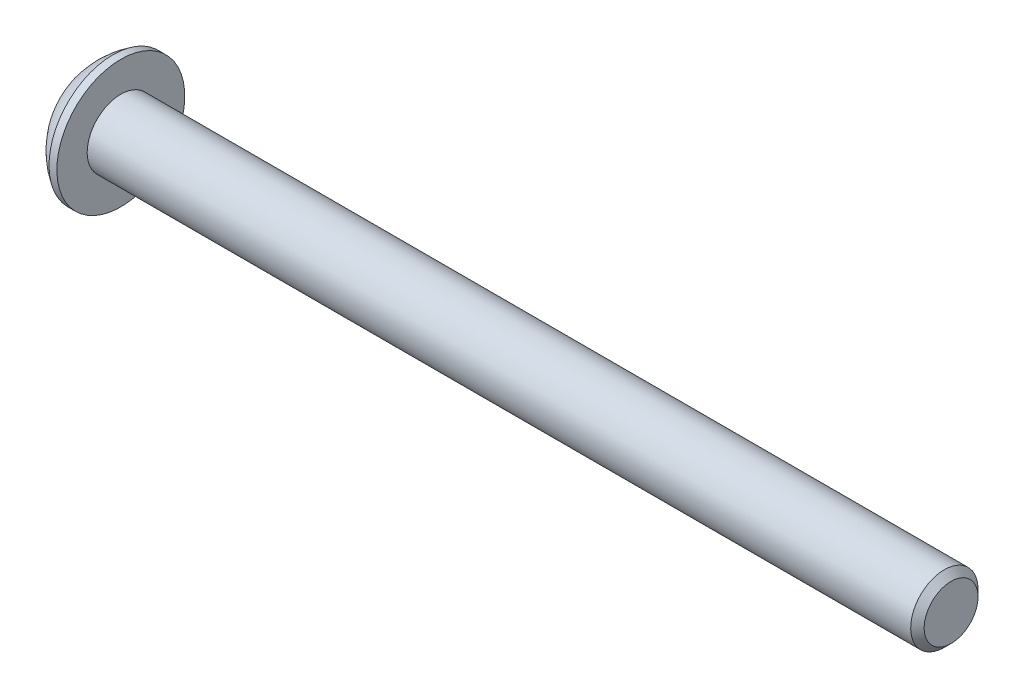
ISO-10303-21;
HEADER;
FILE_DESCRIPTION(('STEP AP214'),'2;1');
FILE_NAME('part.step','',(''),(''),'','','');
FILE_SCHEMA(('AUTOMOTIVE_DESIGN { 1 0 10303 214 1 1 1 1 }'));
ENDSEC;
DATA;
#1=APPLICATION_CONTEXT('core data for automotive mechanical design processes');
#2=APPLICATION_PROTOCOL_DEFINITION('international standard','automotive_design',2000,#1);
#3=PRODUCT_CONTEXT('',#1,'mechanical');
#4=PRODUCT('Part','Part','',(#3));
#5=PRODUCT_RELATED_PRODUCT_CATEGORY('part','',(#4));
#6=PRODUCT_DEFINITION_FORMATION('','',#4);
#7=PRODUCT_DEFINITION_CONTEXT('part definition',#1,'design');
#8=PRODUCT_DEFINITION('design','',#6,#7);
#9=PRODUCT_DEFINITION_SHAPE('','',#8);
#10=(LENGTH_UNIT() NAMED_UNIT(*) SI_UNIT(.MILLI.,.METRE.));
#11=(NAMED_UNIT(*) PLANE_ANGLE_UNIT() SI_UNIT($,.RADIAN.));
#12=(NAMED_UNIT(*) SI_UNIT($,.STERADIAN.) SOLID_ANGLE_UNIT());
#13=UNCERTAINTY_MEASURE_WITH_UNIT(LENGTH_MEASURE(1.E-05),#10,'distance_accuracy_value','');
#14=(GEOMETRIC_REPRESENTATION_CONTEXT(3) GLOBAL_UNCERTAINTY_ASSIGNED_CONTEXT((#13)) GLOBAL_UNIT_ASSIGNED_CONTEXT((#10,
#11,#12)) REPRESENTATION_CONTEXT('',''));
#15=CARTESIAN_POINT('',(0.,0.,0.));
#16=DIRECTION('',(0.,0.,1.));
#17=DIRECTION('',(1.,0.,0.));
#18=AXIS2_PLACEMENT_3D('',#15,#16,#17);
#19=CARTESIAN_POINT('',(38.65,1.50000000000001,0.));
#20=DIRECTION('',(1.,0.,0.));
#21=DIRECTION('',(0.,1.,0.));
#22=AXIS2_PLACEMENT_3D('',#19,#20,#21);
#23=PLANE('',#22);
#24=CARTESIAN_POINT('',(38.65,0.,0.));
#25=DIRECTION('',(1.,0.,0.));
#26=DIRECTION('',(0.,1.,0.));
#27=AXIS2_PLACEMENT_3D('',#24,#25,#26);
#28=CIRCLE('',#27,1.2);
#29=CARTESIAN_POINT('',(38.65,1.20000000000001,0.));
#30=VERTEX_POINT('',#29);
#31=EDGE_CURVE('E42',#30,#30,#28,.T.);
#32=ORIENTED_EDGE('',*,*,#31,.T.);
#33=EDGE_LOOP('',(#32));
#34=FACE_BOUND('',#33,.T.);
#35=ADVANCED_FACE('F34',(#34),#23,.T.);
#36=CARTESIAN_POINT('',(38.65,0.,0.));
#37=DIRECTION('',(1.,0.,0.));
#38=DIRECTION('',(0.,1.,0.));
#39=AXIS2_PLACEMENT_3D('',#36,#37,#38);
#40=CYLINDRICAL_SURFACE('',#39,1.50000000000001);
#41=CARTESIAN_POINT('',(38.35,0.,0.));
#42=DIRECTION('',(1.,0.,0.));
#43=DIRECTION('',(0.,1.,0.));
#44=AXIS2_PLACEMENT_3D('',#41,#42,#43);
#45=CIRCLE('',#44,1.50000000000001);
#46=CARTESIAN_POINT('',(38.35,1.50000000000001,0.));
#47=VERTEX_POINT('',#46);
#48=EDGE_CURVE('E11',#47,#47,#45,.F.);
#49=ORIENTED_EDGE('',*,*,#48,.T.);
#50=EDGE_LOOP('',(#49));
#51=FACE_BOUND('',#50,.T.);
#52=CARTESIAN_POINT('',(1.65,0.,0.));
#53=DIRECTION('',(1.,0.,0.));
#54=DIRECTION('',(0.,1.,0.));
#55=AXIS2_PLACEMENT_3D('',#52,#53,#54);
#56=CIRCLE('',#55,1.50000000000002);
#57=CARTESIAN_POINT('',(1.65,1.50000000000002,0.));
#58=VERTEX_POINT('',#57);
#59=EDGE_CURVE('E150',#58,#58,#56,.T.);
#60=ORIENTED_EDGE('',*,*,#59,.T.);
#61=EDGE_LOOP('',(#60));
#62=FACE_BOUND('',#61,.T.);
#63=ADVANCED_FACE('F171',(#51,#62),#40,.T.);
#64=CARTESIAN_POINT('',(1.65,2.85,0.));
#65=DIRECTION('',(1.,0.,0.));
#66=DIRECTION('',(0.,1.,0.));
#67=AXIS2_PLACEMENT_3D('',#64,#65,#66);
#68=PLANE('',#67);
#69=CARTESIAN_POINT('',(1.65,0.,0.));
#70=DIRECTION('',(1.,0.,0.));
#71=DIRECTION('',(0.,1.,0.));
#72=AXIS2_PLACEMENT_3D('',#69,#70,#71);
#73=CIRCLE('',#72,2.85);
#74=CARTESIAN_POINT('',(1.65,2.85,0.));
#75=VERTEX_POINT('',#74);
#76=EDGE_CURVE('E147',#75,#75,#73,.T.);
#77=ORIENTED_EDGE('',*,*,#76,.T.);
#78=EDGE_LOOP('',(#77));
#79=FACE_BOUND('',#78,.T.);
#80=ORIENTED_EDGE('',*,*,#59,.F.);
#81=EDGE_LOOP('',(#80));
#82=FACE_BOUND('',#81,.T.);
#83=ADVANCED_FACE('F175',(#79,#82),#68,.T.);
#84=CARTESIAN_POINT('',(38.65,0.,0.));
#85=DIRECTION('',(1.,0.,0.));
#86=DIRECTION('',(0.,1.,0.));
#87=AXIS2_PLACEMENT_3D('',#84,#85,#86);
#88=CYLINDRICAL_SURFACE('',#87,2.84999999999999);
#89=CARTESIAN_POINT('',(1.3,0.,0.));
#90=DIRECTION('',(1.,0.,0.));
#91=DIRECTION('',(0.,1.,0.));
#92=AXIS2_PLACEMENT_3D('',#89,#90,#91);
#93=CIRCLE('',#92,2.84999999999999);
#94=CARTESIAN_POINT('',(1.3,2.84999999999999,0.));
#95=VERTEX_POINT('',#94);
#96=EDGE_CURVE('E144',#95,#95,#93,.T.);
#97=ORIENTED_EDGE('',*,*,#96,.T.);
#98=EDGE_LOOP('',(#97));
#99=FACE_BOUND('',#98,.T.);
#100=ORIENTED_EDGE('',*,*,#76,.F.);
#101=EDGE_LOOP('',(#100));
#102=FACE_BOUND('',#101,.T.);
#103=ADVANCED_FACE('F181',(#99,#102),#88,.T.);
#104=CARTESIAN_POINT('',(3.13199341721866,0.,0.));
#105=DIRECTION('',(1.,0.,0.));
#106=DIRECTION('',(0.,1.,0.));
#107=AXIS2_PLACEMENT_3D('',#104,#105,#106);
#108=DEGENERATE_TOROIDAL_SURFACE('',#107,0.132247494636811,3.5,.F.);
#109=CARTESIAN_POINT('',(0.,0.,0.));
#110=DIRECTION('',(1.,0.,0.));
#111=DIRECTION('',(0.,1.,0.));
#112=AXIS2_PLACEMENT_3D('',#109,#110,#111);
#113=CIRCLE('',#112,1.43);
#114=CARTESIAN_POINT('',(0.,1.43,0.));
#115=VERTEX_POINT('',#114);
#116=EDGE_CURVE('E136',#115,#115,#113,.T.);
#117=ORIENTED_EDGE('',*,*,#116,.T.);
#118=EDGE_LOOP('',(#117));
#119=FACE_BOUND('',#118,.T.);
#120=ORIENTED_EDGE('',*,*,#96,.F.);
#121=EDGE_LOOP('',(#120));
#122=FACE_BOUND('',#121,.T.);
#123=ADVANCED_FACE('F166',(#119,#122),#108,.F.);
#124=CARTESIAN_POINT('',(0.,0.,0.));
#125=DIRECTION('',(-1.,0.,0.));
#126=DIRECTION('',(0.,-1.,0.));
#127=AXIS2_PLACEMENT_3D('',#124,#125,#126);
#128=PLANE('',#127);
#129=DIRECTION('',(0.,0.5,0.866025403784438));
#130=VECTOR('',#129,1.);
#131=CARTESIAN_POINT('',(0.,-1.15470053837925,0.));
#132=LINE('',#131,#130);
#133=CARTESIAN_POINT('',(0.,-1.15470053837925,0.));
#134=VERTEX_POINT('',#133);
#135=CARTESIAN_POINT('',(0.,-0.577350269189625,1.));
#136=VERTEX_POINT('',#135);
#137=EDGE_CURVE('E49',#134,#136,#132,.T.);
#138=ORIENTED_EDGE('',*,*,#137,.F.);
#139=DIRECTION('',(0.,-0.5,0.866025403784439));
#140=VECTOR('',#139,1.);
#141=CARTESIAN_POINT('',(0.,-0.577350269189626,-1.));
#142=LINE('',#141,#140);
#143=CARTESIAN_POINT('',(0.,-0.577350269189626,-1.));
#144=VERTEX_POINT('',#143);
#145=EDGE_CURVE('E132',#144,#134,#142,.T.);
#146=ORIENTED_EDGE('',*,*,#145,.F.);
#147=DIRECTION('',(0.,-1.,0.));
#148=VECTOR('',#147,1.);
#149=CARTESIAN_POINT('',(0.,0.577350269189626,-1.));
#150=LINE('',#149,#148);
#151=CARTESIAN_POINT('',(0.,0.577350269189626,-1.));
#152=VERTEX_POINT('',#151);
#153=EDGE_CURVE('E130',#152,#144,#150,.T.);
#154=ORIENTED_EDGE('',*,*,#153,.F.);
#155=DIRECTION('',(0.,-0.5,-0.866025403784438));
#156=VECTOR('',#155,1.);
#157=CARTESIAN_POINT('',(0.,1.15470053837925,0.));
#158=LINE('',#157,#156);
#159=CARTESIAN_POINT('',(0.,1.15470053837925,0.));
#160=VERTEX_POINT('',#159);
#161=EDGE_CURVE('E97',#160,#152,#158,.T.);
#162=ORIENTED_EDGE('',*,*,#161,.F.);
#163=DIRECTION('',(0.,0.5,-0.866025403784439));
#164=VECTOR('',#163,1.);
#165=CARTESIAN_POINT('',(0.,0.577350269189627,1.));
#166=LINE('',#165,#164);
#167=CARTESIAN_POINT('',(0.,0.577350269189627,1.));
#168=VERTEX_POINT('',#167);
#169=EDGE_CURVE('E126',#168,#160,#166,.T.);
#170=ORIENTED_EDGE('',*,*,#169,.F.);
#171=DIRECTION('',(0.,1.,0.));
#172=VECTOR('',#171,1.);
#173=CARTESIAN_POINT('',(0.,-0.577350269189625,1.));
#174=LINE('',#173,#172);
#175=EDGE_CURVE('E123',#136,#168,#174,.T.);
#176=ORIENTED_EDGE('',*,*,#175,.F.);
#177=EDGE_LOOP('',(#138,#146,#154,#162,#170,#176));
#178=FACE_BOUND('',#177,.T.);
#179=ORIENTED_EDGE('',*,*,#116,.F.);
#180=EDGE_LOOP('',(#179));
#181=FACE_BOUND('',#180,.T.);
#182=ADVANCED_FACE('F158',(#178,#181),#128,.T.);
#183=CARTESIAN_POINT('',(38.65,0.,0.));
#184=DIRECTION('',(-1.,0.,0.));
#185=DIRECTION('',(0.,-1.,0.));
#186=AXIS2_PLACEMENT_3D('',#183,#184,#185);
#187=CONICAL_SURFACE('',#186,1.2,0.785398163397454);
#188=ORIENTED_EDGE('',*,*,#48,.F.);
#189=EDGE_LOOP('',(#188));
#190=FACE_BOUND('',#189,.T.);
#191=ORIENTED_EDGE('',*,*,#31,.F.);
#192=EDGE_LOOP('',(#191));
#193=FACE_BOUND('',#192,.T.);
#194=ADVANCED_FACE('F36',(#190,#193),#187,.T.);
#195=CARTESIAN_POINT('',(1.,-1.15470053837925,0.));
#196=DIRECTION('',(0.,-0.866025403784438,0.5));
#197=DIRECTION('',(0.,-0.5,-0.866025403784438));
#198=AXIS2_PLACEMENT_3D('',#195,#196,#197);
#199=PLANE('',#198);
#200=ORIENTED_EDGE('',*,*,#137,.T.);
#201=DIRECTION('',(-1.,0.,0.));
#202=VECTOR('',#201,1.);
#203=CARTESIAN_POINT('',(1.,-0.577350269189625,1.));
#204=LINE('',#203,#202);
#205=CARTESIAN_POINT('',(1.,-0.577350269189625,1.));
#206=VERTEX_POINT('',#205);
#207=EDGE_CURVE('E79',#206,#136,#204,.T.);
#208=ORIENTED_EDGE('',*,*,#207,.F.);
#209=DIRECTION('',(0.,0.5,0.866025403784438));
#210=VECTOR('',#209,1.);
#211=CARTESIAN_POINT('',(1.,-1.15470053837925,0.));
#212=LINE('',#211,#210);
#213=CARTESIAN_POINT('',(1.,-1.15470053837925,0.));
#214=VERTEX_POINT('',#213);
#215=EDGE_CURVE('E134',#214,#206,#212,.T.);
#216=ORIENTED_EDGE('',*,*,#215,.F.);
#217=DIRECTION('',(-1.,0.,0.));
#218=VECTOR('',#217,1.);
#219=CARTESIAN_POINT('',(1.,-1.15470053837925,0.));
#220=LINE('',#219,#218);
#221=EDGE_CURVE('E57',#214,#134,#220,.T.);
#222=ORIENTED_EDGE('',*,*,#221,.T.);
#223=EDGE_LOOP('',(#200,#208,#216,#222));
#224=FACE_BOUND('',#223,.T.);
#225=ADVANCED_FACE('F157',(#224),#199,.F.);
#226=CARTESIAN_POINT('',(1.,-0.577350269189626,-1.));
#227=DIRECTION('',(0.,-0.866025403784439,-0.5));
#228=DIRECTION('',(0.,0.5,-0.866025403784439));
#229=AXIS2_PLACEMENT_3D('',#226,#227,#228);
#230=PLANE('',#229);
#231=ORIENTED_EDGE('',*,*,#145,.T.);
#232=ORIENTED_EDGE('',*,*,#221,.F.);
#233=DIRECTION('',(0.,-0.5,0.866025403784439));
#234=VECTOR('',#233,1.);
#235=CARTESIAN_POINT('',(1.,-0.577350269189626,-1.));
#236=LINE('',#235,#234);
#237=CARTESIAN_POINT('',(1.,-0.577350269189626,-1.));
#238=VERTEX_POINT('',#237);
#239=EDGE_CURVE('E109',#238,#214,#236,.T.);
#240=ORIENTED_EDGE('',*,*,#239,.F.);
#241=DIRECTION('',(-1.,0.,0.));
#242=VECTOR('',#241,1.);
#243=CARTESIAN_POINT('',(1.,-0.577350269189626,-1.));
#244=LINE('',#243,#242);
#245=EDGE_CURVE('E101',#238,#144,#244,.T.);
#246=ORIENTED_EDGE('',*,*,#245,.T.);
#247=EDGE_LOOP('',(#231,#232,#240,#246));
#248=FACE_BOUND('',#247,.T.);
#249=ADVANCED_FACE('F164',(#248),#230,.F.);
#250=CARTESIAN_POINT('',(1.,0.577350269189626,-1.));
#251=DIRECTION('',(0.,0.,-1.));
#252=DIRECTION('',(-1.,0.,0.));
#253=AXIS2_PLACEMENT_3D('',#250,#251,#252);
#254=PLANE('',#253);
#255=ORIENTED_EDGE('',*,*,#153,.T.);
#256=ORIENTED_EDGE('',*,*,#245,.F.);
#257=DIRECTION('',(0.,-1.,0.));
#258=VECTOR('',#257,1.);
#259=CARTESIAN_POINT('',(1.,0.577350269189626,-1.));
#260=LINE('',#259,#258);
#261=CARTESIAN_POINT('',(1.,0.577350269189626,-1.));
#262=VERTEX_POINT('',#261);
#263=EDGE_CURVE('E105',#262,#238,#260,.T.);
#264=ORIENTED_EDGE('',*,*,#263,.F.);
#265=DIRECTION('',(-1.,0.,0.));
#266=VECTOR('',#265,1.);
#267=CARTESIAN_POINT('',(1.,0.577350269189626,-1.));
#268=LINE('',#267,#266);
#269=EDGE_CURVE('E90',#262,#152,#268,.T.);
#270=ORIENTED_EDGE('',*,*,#269,.T.);
#271=EDGE_LOOP('',(#255,#256,#264,#270));
#272=FACE_BOUND('',#271,.T.);
#273=ADVANCED_FACE('F106',(#272),#254,.F.);
#274=CARTESIAN_POINT('',(1.,1.15470053837925,0.));
#275=DIRECTION('',(0.,0.866025403784438,-0.5));
#276=DIRECTION('',(0.,0.5,0.866025403784439));
#277=AXIS2_PLACEMENT_3D('',#274,#275,#276);
#278=PLANE('',#277);
#279=ORIENTED_EDGE('',*,*,#161,.T.);
#280=ORIENTED_EDGE('',*,*,#269,.F.);
#281=DIRECTION('',(0.,-0.5,-0.866025403784438));
#282=VECTOR('',#281,1.);
#283=CARTESIAN_POINT('',(1.,1.15470053837925,0.));
#284=LINE('',#283,#282);
#285=CARTESIAN_POINT('',(1.,1.15470053837925,0.));
#286=VERTEX_POINT('',#285);
#287=EDGE_CURVE('E94',#286,#262,#284,.T.);
#288=ORIENTED_EDGE('',*,*,#287,.F.);
#289=DIRECTION('',(-1.,0.,0.));
#290=VECTOR('',#289,1.);
#291=CARTESIAN_POINT('',(1.,1.15470053837925,0.));
#292=LINE('',#291,#290);
#293=EDGE_CURVE('E102',#286,#160,#292,.T.);
#294=ORIENTED_EDGE('',*,*,#293,.T.);
#295=EDGE_LOOP('',(#279,#280,#288,#294));
#296=FACE_BOUND('',#295,.T.);
#297=ADVANCED_FACE('F92',(#296),#278,.F.);
#298=CARTESIAN_POINT('',(1.,0.577350269189627,1.));
#299=DIRECTION('',(0.,0.866025403784439,0.5));
#300=DIRECTION('',(0.,-0.5,0.866025403784439));
#301=AXIS2_PLACEMENT_3D('',#298,#299,#300);
#302=PLANE('',#301);
#303=ORIENTED_EDGE('',*,*,#169,.T.);
#304=ORIENTED_EDGE('',*,*,#293,.F.);
#305=DIRECTION('',(0.,0.5,-0.866025403784439));
#306=VECTOR('',#305,1.);
#307=CARTESIAN_POINT('',(1.,0.577350269189627,1.));
#308=LINE('',#307,#306);
#309=CARTESIAN_POINT('',(1.,0.577350269189627,1.));
#310=VERTEX_POINT('',#309);
#311=EDGE_CURVE('E115',#310,#286,#308,.T.);
#312=ORIENTED_EDGE('',*,*,#311,.F.);
#313=DIRECTION('',(-1.,0.,0.));
#314=VECTOR('',#313,1.);
#315=CARTESIAN_POINT('',(1.,0.577350269189627,1.));
#316=LINE('',#315,#314);
#317=EDGE_CURVE('E139',#310,#168,#316,.T.);
#318=ORIENTED_EDGE('',*,*,#317,.T.);
#319=EDGE_LOOP('',(#303,#304,#312,#318));
#320=FACE_BOUND('',#319,.T.);
#321=ADVANCED_FACE('F192',(#320),#302,.F.);
#322=CARTESIAN_POINT('',(1.,-0.577350269189625,1.));
#323=DIRECTION('',(0.,0.,1.));
#324=DIRECTION('',(0.,-1.,0.));
#325=AXIS2_PLACEMENT_3D('',#322,#323,#324);
#326=PLANE('',#325);
#327=ORIENTED_EDGE('',*,*,#175,.T.);
#328=ORIENTED_EDGE('',*,*,#317,.F.);
#329=DIRECTION('',(0.,1.,0.));
#330=VECTOR('',#329,1.);
#331=CARTESIAN_POINT('',(1.,-0.577350269189625,1.));
#332=LINE('',#331,#330);
#333=EDGE_CURVE('E117',#206,#310,#332,.T.);
#334=ORIENTED_EDGE('',*,*,#333,.F.);
#335=ORIENTED_EDGE('',*,*,#207,.T.);
#336=EDGE_LOOP('',(#327,#328,#334,#335));
#337=FACE_BOUND('',#336,.T.);
#338=ADVANCED_FACE('F189',(#337),#326,.F.);
#339=CARTESIAN_POINT('',(1.,0.,0.));
#340=DIRECTION('',(-1.,0.,0.));
#341=DIRECTION('',(0.,-1.,0.));
#342=AXIS2_PLACEMENT_3D('',#339,#340,#341);
#343=PLANE('',#342);
#344=ORIENTED_EDGE('',*,*,#215,.T.);
#345=ORIENTED_EDGE('',*,*,#333,.T.);
#346=ORIENTED_EDGE('',*,*,#311,.T.);
#347=ORIENTED_EDGE('',*,*,#287,.T.);
#348=ORIENTED_EDGE('',*,*,#263,.T.);
#349=ORIENTED_EDGE('',*,*,#239,.T.);
#350=EDGE_LOOP('',(#344,#345,#346,#347,#348,#349));
#351=FACE_BOUND('',#350,.T.);
#352=ADVANCED_FACE('F112',(#351),#343,.T.);
#353=CLOSED_SHELL('',(#35,#63,#83,#103,#123,#182,#194,#225,#249,#273,#297,#321,#338,#352));
#354=MANIFOLD_SOLID_BREP('B2',#353);
#355=ADVANCED_BREP_SHAPE_REPRESENTATION('',(#18,#354),#14);
#356=SHAPE_DEFINITION_REPRESENTATION(#9,#355);
ENDSEC;
END-ISO-10303-21;
